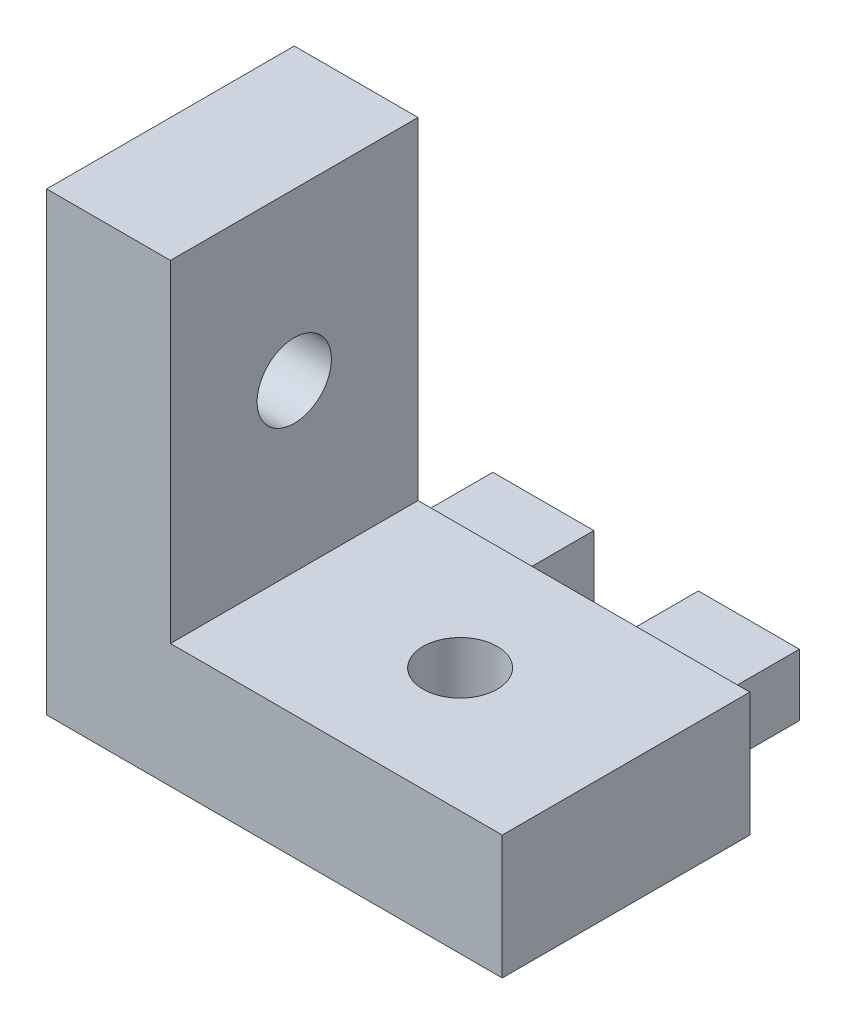
ISO-10303-21;
HEADER;
FILE_DESCRIPTION(('STEP AP214'),'2;1');
FILE_NAME('part.step','',(''),(''),'','','');
FILE_SCHEMA(('AUTOMOTIVE_DESIGN { 1 0 10303 214 1 1 1 1 }'));
ENDSEC;
DATA;
#1=APPLICATION_CONTEXT('core data for automotive mechanical design processes');
#2=APPLICATION_PROTOCOL_DEFINITION('international standard','automotive_design',2000,#1);
#3=PRODUCT_CONTEXT('',#1,'mechanical');
#4=PRODUCT('Part','Part','',(#3));
#5=PRODUCT_RELATED_PRODUCT_CATEGORY('part','',(#4));
#6=PRODUCT_DEFINITION_FORMATION('','',#4);
#7=PRODUCT_DEFINITION_CONTEXT('part definition',#1,'design');
#8=PRODUCT_DEFINITION('design','',#6,#7);
#9=PRODUCT_DEFINITION_SHAPE('','',#8);
#10=(LENGTH_UNIT() NAMED_UNIT(*) SI_UNIT(.MILLI.,.METRE.));
#11=(NAMED_UNIT(*) PLANE_ANGLE_UNIT() SI_UNIT($,.RADIAN.));
#12=(NAMED_UNIT(*) SI_UNIT($,.STERADIAN.) SOLID_ANGLE_UNIT());
#13=UNCERTAINTY_MEASURE_WITH_UNIT(LENGTH_MEASURE(1.E-05),#10,'distance_accuracy_value','');
#14=(GEOMETRIC_REPRESENTATION_CONTEXT(3) GLOBAL_UNCERTAINTY_ASSIGNED_CONTEXT((#13)) GLOBAL_UNIT_ASSIGNED_CONTEXT((#10,
#11,#12)) REPRESENTATION_CONTEXT('',''));
#15=CARTESIAN_POINT('',(0.,0.,0.));
#16=DIRECTION('',(0.,0.,1.));
#17=DIRECTION('',(1.,0.,0.));
#18=AXIS2_PLACEMENT_3D('',#15,#16,#17);
#19=CARTESIAN_POINT('',(0.,0.,0.));
#20=DIRECTION('',(0.,0.,1.));
#21=DIRECTION('',(1.,0.,0.));
#22=AXIS2_PLACEMENT_3D('',#19,#20,#21);
#23=PLANE('',#22);
#24=DIRECTION('',(0.,-1.,0.));
#25=VECTOR('',#24,1.);
#26=CARTESIAN_POINT('',(9.64242424242423,-3.37121212121211,0.));
#27=LINE('',#26,#25);
#28=CARTESIAN_POINT('',(9.64242424242423,-3.37121212121211,0.));
#29=VERTEX_POINT('',#28);
#30=CARTESIAN_POINT('',(9.64242424242423,-5.87121212121211,0.));
#31=VERTEX_POINT('',#30);
#32=EDGE_CURVE('E172',#29,#31,#27,.T.);
#33=ORIENTED_EDGE('',*,*,#32,.F.);
#34=DIRECTION('',(-1.,0.,0.));
#35=VECTOR('',#34,1.);
#36=CARTESIAN_POINT('',(5.56507414431163,-3.37121212121211,0.));
#37=LINE('',#36,#35);
#38=CARTESIAN_POINT('',(5.56507414431163,-3.37121212121211,0.));
#39=VERTEX_POINT('',#38);
#40=EDGE_CURVE('E148',#29,#39,#37,.T.);
#41=ORIENTED_EDGE('',*,*,#40,.T.);
#42=DIRECTION('',(0.,-1.,0.));
#43=VECTOR('',#42,1.);
#44=CARTESIAN_POINT('',(5.56507414431163,-3.37121212121211,0.));
#45=LINE('',#44,#43);
#46=CARTESIAN_POINT('',(5.56507414431163,-5.87121212121211,0.));
#47=VERTEX_POINT('',#46);
#48=EDGE_CURVE('E160',#39,#47,#45,.T.);
#49=ORIENTED_EDGE('',*,*,#48,.T.);
#50=DIRECTION('',(1.,0.,0.));
#51=VECTOR('',#50,1.);
#52=CARTESIAN_POINT('',(-5.75757575757576,-5.87121212121211,0.));
#53=LINE('',#52,#51);
#54=CARTESIAN_POINT('',(1.34242424242423,-5.87121212121211,0.));
#55=VERTEX_POINT('',#54);
#56=EDGE_CURVE('E235',#55,#47,#53,.T.);
#57=ORIENTED_EDGE('',*,*,#56,.F.);
#58=DIRECTION('',(0.,-1.,0.));
#59=VECTOR('',#58,1.);
#60=CARTESIAN_POINT('',(1.34242424242423,-3.37121212121211,0.));
#61=LINE('',#60,#59);
#62=CARTESIAN_POINT('',(1.34242424242423,-3.37121212121211,0.));
#63=VERTEX_POINT('',#62);
#64=EDGE_CURVE('E180',#63,#55,#61,.T.);
#65=ORIENTED_EDGE('',*,*,#64,.F.);
#66=DIRECTION('',(-1.,0.,0.));
#67=VECTOR('',#66,1.);
#68=CARTESIAN_POINT('',(-2.73757575757577,-3.37121212121211,0.));
#69=LINE('',#68,#67);
#70=CARTESIAN_POINT('',(-2.73757575757577,-3.37121212121211,0.));
#71=VERTEX_POINT('',#70);
#72=EDGE_CURVE('E177',#63,#71,#69,.T.);
#73=ORIENTED_EDGE('',*,*,#72,.T.);
#74=DIRECTION('',(0.,-1.,0.));
#75=VECTOR('',#74,1.);
#76=CARTESIAN_POINT('',(-2.73757575757577,-3.37121212121211,0.));
#77=LINE('',#76,#75);
#78=CARTESIAN_POINT('',(-2.73757575757577,-5.87121212121211,0.));
#79=VERTEX_POINT('',#78);
#80=EDGE_CURVE('E182',#71,#79,#77,.T.);
#81=ORIENTED_EDGE('',*,*,#80,.T.);
#82=CARTESIAN_POINT('',(-5.75757575757576,-5.87121212121211,0.));
#83=VERTEX_POINT('',#82);
#84=EDGE_CURVE('E231',#83,#79,#53,.T.);
#85=ORIENTED_EDGE('',*,*,#84,.F.);
#86=DIRECTION('',(0.,-1.,0.));
#87=VECTOR('',#86,1.);
#88=CARTESIAN_POINT('',(-5.75757575757576,12.5287878787879,0.));
#89=LINE('',#88,#87);
#90=CARTESIAN_POINT('',(-5.75757575757576,12.5287878787879,0.));
#91=VERTEX_POINT('',#90);
#92=EDGE_CURVE('E212',#91,#83,#89,.T.);
#93=ORIENTED_EDGE('',*,*,#92,.F.);
#94=DIRECTION('',(-1.,0.,0.));
#95=VECTOR('',#94,1.);
#96=CARTESIAN_POINT('',(-0.757575757575761,12.5287878787879,0.));
#97=LINE('',#96,#95);
#98=CARTESIAN_POINT('',(-0.757575757575761,12.5287878787879,0.));
#99=VERTEX_POINT('',#98);
#100=EDGE_CURVE('E217',#99,#91,#97,.T.);
#101=ORIENTED_EDGE('',*,*,#100,.F.);
#102=DIRECTION('',(0.,1.,0.));
#103=VECTOR('',#102,1.);
#104=CARTESIAN_POINT('',(-0.757575757575761,-0.871212121212111,0.));
#105=LINE('',#104,#103);
#106=CARTESIAN_POINT('',(-0.757575757575761,-0.871212121212111,0.));
#107=VERTEX_POINT('',#106);
#108=EDGE_CURVE('E239',#107,#99,#105,.T.);
#109=ORIENTED_EDGE('',*,*,#108,.F.);
#110=DIRECTION('',(-1.,0.,0.));
#111=VECTOR('',#110,1.);
#112=CARTESIAN_POINT('',(12.6424242424242,-0.871212121212109,0.));
#113=LINE('',#112,#111);
#114=CARTESIAN_POINT('',(12.6424242424242,-0.871212121212109,0.));
#115=VERTEX_POINT('',#114);
#116=EDGE_CURVE('E237',#115,#107,#113,.T.);
#117=ORIENTED_EDGE('',*,*,#116,.F.);
#118=DIRECTION('',(0.,1.,0.));
#119=VECTOR('',#118,1.);
#120=CARTESIAN_POINT('',(12.6424242424242,-5.87121212121211,0.));
#121=LINE('',#120,#119);
#122=CARTESIAN_POINT('',(12.6424242424242,-5.87121212121211,0.));
#123=VERTEX_POINT('',#122);
#124=EDGE_CURVE('E234',#123,#115,#121,.T.);
#125=ORIENTED_EDGE('',*,*,#124,.F.);
#126=EDGE_CURVE('E230',#31,#123,#53,.T.);
#127=ORIENTED_EDGE('',*,*,#126,.F.);
#128=EDGE_LOOP('',(#33,#41,#49,#57,#65,#73,#81,#85,#93,#101,#109,#117,#125,#127));
#129=FACE_BOUND('',#128,.T.);
#130=ADVANCED_FACE('F39',(#129),#23,.F.);
#131=CARTESIAN_POINT('',(-5.75757575757576,12.5287878787879,10.));
#132=DIRECTION('',(1.,0.,0.));
#133=DIRECTION('',(0.,1.,0.));
#134=AXIS2_PLACEMENT_3D('',#131,#132,#133);
#135=PLANE('',#134);
#136=CARTESIAN_POINT('',(-5.75757575757576,5.82878787878789,5.));
#137=DIRECTION('',(1.,0.,0.));
#138=DIRECTION('',(0.,1.,0.));
#139=AXIS2_PLACEMENT_3D('',#136,#137,#138);
#140=CIRCLE('',#139,1.5);
#141=CARTESIAN_POINT('',(-5.75757575757576,7.32878787878789,5.));
#142=VERTEX_POINT('',#141);
#143=EDGE_CURVE('E203',#142,#142,#140,.F.);
#144=ORIENTED_EDGE('',*,*,#143,.F.);
#145=EDGE_LOOP('',(#144));
#146=FACE_BOUND('',#145,.T.);
#147=ORIENTED_EDGE('',*,*,#92,.T.);
#148=DIRECTION('',(0.,0.,-1.));
#149=VECTOR('',#148,1.);
#150=CARTESIAN_POINT('',(-5.75757575757576,-5.87121212121211,10.));
#151=LINE('',#150,#149);
#152=CARTESIAN_POINT('',(-5.75757575757576,-5.87121212121211,10.));
#153=VERTEX_POINT('',#152);
#154=EDGE_CURVE('E11',#153,#83,#151,.T.);
#155=ORIENTED_EDGE('',*,*,#154,.F.);
#156=DIRECTION('',(0.,-1.,0.));
#157=VECTOR('',#156,1.);
#158=CARTESIAN_POINT('',(-5.75757575757576,12.5287878787879,10.));
#159=LINE('',#158,#157);
#160=CARTESIAN_POINT('',(-5.75757575757576,12.5287878787879,10.));
#161=VERTEX_POINT('',#160);
#162=EDGE_CURVE('E213',#161,#153,#159,.T.);
#163=ORIENTED_EDGE('',*,*,#162,.F.);
#164=DIRECTION('',(0.,0.,-1.));
#165=VECTOR('',#164,1.);
#166=CARTESIAN_POINT('',(-5.75757575757576,12.5287878787879,10.));
#167=LINE('',#166,#165);
#168=EDGE_CURVE('E227',#161,#91,#167,.T.);
#169=ORIENTED_EDGE('',*,*,#168,.T.);
#170=EDGE_LOOP('',(#147,#155,#163,#169));
#171=FACE_BOUND('',#170,.T.);
#172=ADVANCED_FACE('F41',(#146,#171),#135,.F.);
#173=CARTESIAN_POINT('',(-5.75757575757576,-5.87121212121211,10.));
#174=DIRECTION('',(0.,1.,0.));
#175=DIRECTION('',(-1.,0.,0.));
#176=AXIS2_PLACEMENT_3D('',#173,#174,#175);
#177=PLANE('',#176);
#178=CARTESIAN_POINT('',(5.94242424242424,-5.87121212121211,5.));
#179=DIRECTION('',(0.,1.,0.));
#180=DIRECTION('',(-1.,0.,0.));
#181=AXIS2_PLACEMENT_3D('',#178,#179,#180);
#182=CIRCLE('',#181,1.5);
#183=CARTESIAN_POINT('',(4.44242424242424,-5.87121212121211,5.));
#184=VERTEX_POINT('',#183);
#185=EDGE_CURVE('E209',#184,#184,#182,.F.);
#186=ORIENTED_EDGE('',*,*,#185,.F.);
#187=EDGE_LOOP('',(#186));
#188=FACE_BOUND('',#187,.T.);
#189=ORIENTED_EDGE('',*,*,#84,.T.);
#190=DIRECTION('',(0.,0.,-1.));
#191=VECTOR('',#190,1.);
#192=CARTESIAN_POINT('',(-2.73757575757577,-5.87121212121211,-5.));
#193=LINE('',#192,#191);
#194=CARTESIAN_POINT('',(-2.73757575757577,-5.87121212121211,-5.));
#195=VERTEX_POINT('',#194);
#196=EDGE_CURVE('E62',#79,#195,#193,.T.);
#197=ORIENTED_EDGE('',*,*,#196,.T.);
#198=DIRECTION('',(1.,0.,0.));
#199=VECTOR('',#198,1.);
#200=CARTESIAN_POINT('',(-2.73757575757577,-5.87121212121211,-5.));
#201=LINE('',#200,#199);
#202=CARTESIAN_POINT('',(1.34242424242423,-5.87121212121211,-5.));
#203=VERTEX_POINT('',#202);
#204=EDGE_CURVE('E187',#195,#203,#201,.T.);
#205=ORIENTED_EDGE('',*,*,#204,.T.);
#206=DIRECTION('',(0.,0.,1.));
#207=VECTOR('',#206,1.);
#208=CARTESIAN_POINT('',(1.34242424242423,-5.87121212121211,-5.));
#209=LINE('',#208,#207);
#210=EDGE_CURVE('E184',#203,#55,#209,.T.);
#211=ORIENTED_EDGE('',*,*,#210,.T.);
#212=ORIENTED_EDGE('',*,*,#56,.T.);
#213=DIRECTION('',(0.,0.,-1.));
#214=VECTOR('',#213,1.);
#215=CARTESIAN_POINT('',(5.56507414431163,-5.87121212121211,-5.));
#216=LINE('',#215,#214);
#217=CARTESIAN_POINT('',(5.56507414431163,-5.87121212121211,-5.));
#218=VERTEX_POINT('',#217);
#219=EDGE_CURVE('E54',#47,#218,#216,.T.);
#220=ORIENTED_EDGE('',*,*,#219,.T.);
#221=DIRECTION('',(1.,0.,0.));
#222=VECTOR('',#221,1.);
#223=CARTESIAN_POINT('',(5.56507414431163,-5.87121212121211,-5.));
#224=LINE('',#223,#222);
#225=CARTESIAN_POINT('',(9.64242424242423,-5.87121212121211,-5.));
#226=VERTEX_POINT('',#225);
#227=EDGE_CURVE('E145',#218,#226,#224,.T.);
#228=ORIENTED_EDGE('',*,*,#227,.T.);
#229=DIRECTION('',(0.,0.,1.));
#230=VECTOR('',#229,1.);
#231=CARTESIAN_POINT('',(9.64242424242423,-5.87121212121211,-5.));
#232=LINE('',#231,#230);
#233=EDGE_CURVE('E161',#226,#31,#232,.T.);
#234=ORIENTED_EDGE('',*,*,#233,.T.);
#235=ORIENTED_EDGE('',*,*,#126,.T.);
#236=DIRECTION('',(0.,0.,-1.));
#237=VECTOR('',#236,1.);
#238=CARTESIAN_POINT('',(12.6424242424242,-5.87121212121211,10.));
#239=LINE('',#238,#237);
#240=CARTESIAN_POINT('',(12.6424242424242,-5.87121212121211,10.));
#241=VERTEX_POINT('',#240);
#242=EDGE_CURVE('E47',#241,#123,#239,.T.);
#243=ORIENTED_EDGE('',*,*,#242,.F.);
#244=DIRECTION('',(1.,0.,0.));
#245=VECTOR('',#244,1.);
#246=CARTESIAN_POINT('',(-5.75757575757576,-5.87121212121211,10.));
#247=LINE('',#246,#245);
#248=EDGE_CURVE('E216',#153,#241,#247,.T.);
#249=ORIENTED_EDGE('',*,*,#248,.F.);
#250=ORIENTED_EDGE('',*,*,#154,.T.);
#251=EDGE_LOOP('',(#189,#197,#205,#211,#212,#220,#228,#234,#235,#243,#249,#250));
#252=FACE_BOUND('',#251,.T.);
#253=ADVANCED_FACE('F280',(#188,#252),#177,.F.);
#254=CARTESIAN_POINT('',(12.6424242424242,-5.87121212121211,10.));
#255=DIRECTION('',(-1.,0.,0.));
#256=DIRECTION('',(0.,0.,1.));
#257=AXIS2_PLACEMENT_3D('',#254,#255,#256);
#258=PLANE('',#257);
#259=ORIENTED_EDGE('',*,*,#124,.T.);
#260=DIRECTION('',(0.,0.,-1.));
#261=VECTOR('',#260,1.);
#262=CARTESIAN_POINT('',(12.6424242424242,-0.871212121212109,10.));
#263=LINE('',#262,#261);
#264=CARTESIAN_POINT('',(12.6424242424242,-0.871212121212109,10.));
#265=VERTEX_POINT('',#264);
#266=EDGE_CURVE('E250',#265,#115,#263,.T.);
#267=ORIENTED_EDGE('',*,*,#266,.F.);
#268=DIRECTION('',(0.,1.,0.));
#269=VECTOR('',#268,1.);
#270=CARTESIAN_POINT('',(12.6424242424242,-5.87121212121211,10.));
#271=LINE('',#270,#269);
#272=EDGE_CURVE('E219',#241,#265,#271,.T.);
#273=ORIENTED_EDGE('',*,*,#272,.F.);
#274=ORIENTED_EDGE('',*,*,#242,.T.);
#275=EDGE_LOOP('',(#259,#267,#273,#274));
#276=FACE_BOUND('',#275,.T.);
#277=ADVANCED_FACE('F257',(#276),#258,.F.);
#278=CARTESIAN_POINT('',(12.6424242424242,-0.871212121212109,10.));
#279=DIRECTION('',(0.,-1.,0.));
#280=DIRECTION('',(1.,0.,0.));
#281=AXIS2_PLACEMENT_3D('',#278,#279,#280);
#282=PLANE('',#281);
#283=CARTESIAN_POINT('',(5.94242424242424,-0.87121212121211,5.));
#284=DIRECTION('',(0.,1.,0.));
#285=DIRECTION('',(-1.,0.,0.));
#286=AXIS2_PLACEMENT_3D('',#283,#284,#285);
#287=CIRCLE('',#286,1.5);
#288=CARTESIAN_POINT('',(4.44242424242424,-0.87121212121211,5.));
#289=VERTEX_POINT('',#288);
#290=EDGE_CURVE('E206',#289,#289,#287,.T.);
#291=ORIENTED_EDGE('',*,*,#290,.F.);
#292=EDGE_LOOP('',(#291));
#293=FACE_BOUND('',#292,.T.);
#294=ORIENTED_EDGE('',*,*,#116,.T.);
#295=DIRECTION('',(0.,0.,-1.));
#296=VECTOR('',#295,1.);
#297=CARTESIAN_POINT('',(-0.757575757575761,-0.871212121212111,10.));
#298=LINE('',#297,#296);
#299=CARTESIAN_POINT('',(-0.757575757575761,-0.871212121212111,10.));
#300=VERTEX_POINT('',#299);
#301=EDGE_CURVE('E247',#300,#107,#298,.T.);
#302=ORIENTED_EDGE('',*,*,#301,.F.);
#303=DIRECTION('',(-1.,0.,0.));
#304=VECTOR('',#303,1.);
#305=CARTESIAN_POINT('',(12.6424242424242,-0.871212121212109,10.));
#306=LINE('',#305,#304);
#307=EDGE_CURVE('E221',#265,#300,#306,.T.);
#308=ORIENTED_EDGE('',*,*,#307,.F.);
#309=ORIENTED_EDGE('',*,*,#266,.T.);
#310=EDGE_LOOP('',(#294,#302,#308,#309));
#311=FACE_BOUND('',#310,.T.);
#312=ADVANCED_FACE('F268',(#293,#311),#282,.F.);
#313=CARTESIAN_POINT('',(-0.757575757575761,-0.871212121212111,10.));
#314=DIRECTION('',(-1.,0.,0.));
#315=DIRECTION('',(0.,0.,1.));
#316=AXIS2_PLACEMENT_3D('',#313,#314,#315);
#317=PLANE('',#316);
#318=CARTESIAN_POINT('',(-0.757575757575761,5.82878787878789,5.));
#319=DIRECTION('',(1.,0.,0.));
#320=DIRECTION('',(0.,0.,-1.));
#321=AXIS2_PLACEMENT_3D('',#318,#319,#320);
#322=CIRCLE('',#321,1.5);
#323=CARTESIAN_POINT('',(-0.757575757575761,5.82878787878789,3.5));
#324=VERTEX_POINT('',#323);
#325=EDGE_CURVE('E171',#324,#324,#322,.T.);
#326=ORIENTED_EDGE('',*,*,#325,.F.);
#327=EDGE_LOOP('',(#326));
#328=FACE_BOUND('',#327,.T.);
#329=ORIENTED_EDGE('',*,*,#108,.T.);
#330=DIRECTION('',(0.,0.,-1.));
#331=VECTOR('',#330,1.);
#332=CARTESIAN_POINT('',(-0.757575757575761,12.5287878787879,10.));
#333=LINE('',#332,#331);
#334=CARTESIAN_POINT('',(-0.757575757575761,12.5287878787879,10.));
#335=VERTEX_POINT('',#334);
#336=EDGE_CURVE('E244',#335,#99,#333,.T.);
#337=ORIENTED_EDGE('',*,*,#336,.F.);
#338=DIRECTION('',(0.,1.,0.));
#339=VECTOR('',#338,1.);
#340=CARTESIAN_POINT('',(-0.757575757575761,-0.871212121212111,10.));
#341=LINE('',#340,#339);
#342=EDGE_CURVE('E223',#300,#335,#341,.T.);
#343=ORIENTED_EDGE('',*,*,#342,.F.);
#344=ORIENTED_EDGE('',*,*,#301,.T.);
#345=EDGE_LOOP('',(#329,#337,#343,#344));
#346=FACE_BOUND('',#345,.T.);
#347=ADVANCED_FACE('F272',(#328,#346),#317,.F.);
#348=CARTESIAN_POINT('',(-0.757575757575761,12.5287878787879,10.));
#349=DIRECTION('',(0.,-1.,0.));
#350=DIRECTION('',(0.,0.,-1.));
#351=AXIS2_PLACEMENT_3D('',#348,#349,#350);
#352=PLANE('',#351);
#353=ORIENTED_EDGE('',*,*,#100,.T.);
#354=ORIENTED_EDGE('',*,*,#168,.F.);
#355=DIRECTION('',(-1.,0.,0.));
#356=VECTOR('',#355,1.);
#357=CARTESIAN_POINT('',(-0.757575757575761,12.5287878787879,10.));
#358=LINE('',#357,#356);
#359=EDGE_CURVE('E225',#335,#161,#358,.T.);
#360=ORIENTED_EDGE('',*,*,#359,.F.);
#361=ORIENTED_EDGE('',*,*,#336,.T.);
#362=EDGE_LOOP('',(#353,#354,#360,#361));
#363=FACE_BOUND('',#362,.T.);
#364=ADVANCED_FACE('F321',(#363),#352,.F.);
#365=CARTESIAN_POINT('',(0.,0.,10.));
#366=DIRECTION('',(0.,0.,1.));
#367=DIRECTION('',(1.,0.,0.));
#368=AXIS2_PLACEMENT_3D('',#365,#366,#367);
#369=PLANE('',#368);
#370=ORIENTED_EDGE('',*,*,#162,.T.);
#371=ORIENTED_EDGE('',*,*,#248,.T.);
#372=ORIENTED_EDGE('',*,*,#272,.T.);
#373=ORIENTED_EDGE('',*,*,#307,.T.);
#374=ORIENTED_EDGE('',*,*,#342,.T.);
#375=ORIENTED_EDGE('',*,*,#359,.T.);
#376=EDGE_LOOP('',(#370,#371,#372,#373,#374,#375));
#377=FACE_BOUND('',#376,.T.);
#378=ADVANCED_FACE('F276',(#377),#369,.T.);
#379=CARTESIAN_POINT('',(5.94242424242424,-5.87221212121211,5.));
#380=DIRECTION('',(0.,1.,0.));
#381=DIRECTION('',(-1.,0.,0.));
#382=AXIS2_PLACEMENT_3D('',#379,#380,#381);
#383=CYLINDRICAL_SURFACE('',#382,1.5);
#384=ORIENTED_EDGE('',*,*,#290,.T.);
#385=EDGE_LOOP('',(#384));
#386=FACE_BOUND('',#385,.T.);
#387=ORIENTED_EDGE('',*,*,#185,.T.);
#388=EDGE_LOOP('',(#387));
#389=FACE_BOUND('',#388,.T.);
#390=ADVANCED_FACE('F338',(#386,#389),#383,.F.);
#391=CARTESIAN_POINT('',(-5.75857575757576,5.82878787878789,5.));
#392=DIRECTION('',(1.,0.,0.));
#393=DIRECTION('',(0.,0.,-1.));
#394=AXIS2_PLACEMENT_3D('',#391,#392,#393);
#395=CYLINDRICAL_SURFACE('',#394,1.5);
#396=ORIENTED_EDGE('',*,*,#325,.T.);
#397=EDGE_LOOP('',(#396));
#398=FACE_BOUND('',#397,.T.);
#399=ORIENTED_EDGE('',*,*,#143,.T.);
#400=EDGE_LOOP('',(#399));
#401=FACE_BOUND('',#400,.T.);
#402=ADVANCED_FACE('F340',(#398,#401),#395,.F.);
#403=CARTESIAN_POINT('',(-2.73757575757577,-3.37121212121211,-5.));
#404=DIRECTION('',(-1.,0.,0.));
#405=DIRECTION('',(0.,-1.,0.));
#406=AXIS2_PLACEMENT_3D('',#403,#404,#405);
#407=PLANE('',#406);
#408=ORIENTED_EDGE('',*,*,#196,.F.);
#409=ORIENTED_EDGE('',*,*,#80,.F.);
#410=DIRECTION('',(0.,0.,-1.));
#411=VECTOR('',#410,1.);
#412=CARTESIAN_POINT('',(-2.73757575757577,-3.37121212121211,-5.));
#413=LINE('',#412,#411);
#414=CARTESIAN_POINT('',(-2.73757575757577,-3.37121212121211,-5.));
#415=VERTEX_POINT('',#414);
#416=EDGE_CURVE('E188',#71,#415,#413,.T.);
#417=ORIENTED_EDGE('',*,*,#416,.T.);
#418=DIRECTION('',(0.,-1.,0.));
#419=VECTOR('',#418,1.);
#420=CARTESIAN_POINT('',(-2.73757575757577,-3.37121212121211,-5.));
#421=LINE('',#420,#419);
#422=EDGE_CURVE('E175',#415,#195,#421,.T.);
#423=ORIENTED_EDGE('',*,*,#422,.T.);
#424=EDGE_LOOP('',(#408,#409,#417,#423));
#425=FACE_BOUND('',#424,.T.);
#426=ADVANCED_FACE('F286',(#425),#407,.T.);
#427=CARTESIAN_POINT('',(1.34242424242423,-3.37121212121211,-5.));
#428=DIRECTION('',(1.,0.,0.));
#429=DIRECTION('',(0.,1.,0.));
#430=AXIS2_PLACEMENT_3D('',#427,#428,#429);
#431=PLANE('',#430);
#432=ORIENTED_EDGE('',*,*,#210,.F.);
#433=DIRECTION('',(0.,-1.,0.));
#434=VECTOR('',#433,1.);
#435=CARTESIAN_POINT('',(1.34242424242423,-3.37121212121211,-5.));
#436=LINE('',#435,#434);
#437=CARTESIAN_POINT('',(1.34242424242423,-3.37121212121211,-5.));
#438=VERTEX_POINT('',#437);
#439=EDGE_CURVE('E178',#438,#203,#436,.T.);
#440=ORIENTED_EDGE('',*,*,#439,.F.);
#441=DIRECTION('',(0.,0.,1.));
#442=VECTOR('',#441,1.);
#443=CARTESIAN_POINT('',(1.34242424242423,-3.37121212121211,-5.));
#444=LINE('',#443,#442);
#445=EDGE_CURVE('E194',#438,#63,#444,.T.);
#446=ORIENTED_EDGE('',*,*,#445,.T.);
#447=ORIENTED_EDGE('',*,*,#64,.T.);
#448=EDGE_LOOP('',(#432,#440,#446,#447));
#449=FACE_BOUND('',#448,.T.);
#450=ADVANCED_FACE('F350',(#449),#431,.T.);
#451=CARTESIAN_POINT('',(-2.73757575757577,-3.37121212121211,-5.));
#452=DIRECTION('',(0.,0.,-1.));
#453=DIRECTION('',(-1.,0.,0.));
#454=AXIS2_PLACEMENT_3D('',#451,#452,#453);
#455=PLANE('',#454);
#456=ORIENTED_EDGE('',*,*,#204,.F.);
#457=ORIENTED_EDGE('',*,*,#422,.F.);
#458=DIRECTION('',(1.,0.,0.));
#459=VECTOR('',#458,1.);
#460=CARTESIAN_POINT('',(-2.73757575757577,-3.37121212121211,-5.));
#461=LINE('',#460,#459);
#462=EDGE_CURVE('E196',#415,#438,#461,.T.);
#463=ORIENTED_EDGE('',*,*,#462,.T.);
#464=ORIENTED_EDGE('',*,*,#439,.T.);
#465=EDGE_LOOP('',(#456,#457,#463,#464));
#466=FACE_BOUND('',#465,.T.);
#467=ADVANCED_FACE('F293',(#466),#455,.T.);
#468=CARTESIAN_POINT('',(0.,-3.37121212121211,0.));
#469=DIRECTION('',(0.,1.,0.));
#470=DIRECTION('',(0.,0.,1.));
#471=AXIS2_PLACEMENT_3D('',#468,#469,#470);
#472=PLANE('',#471);
#473=ORIENTED_EDGE('',*,*,#416,.F.);
#474=ORIENTED_EDGE('',*,*,#72,.F.);
#475=ORIENTED_EDGE('',*,*,#445,.F.);
#476=ORIENTED_EDGE('',*,*,#462,.F.);
#477=EDGE_LOOP('',(#473,#474,#475,#476));
#478=FACE_BOUND('',#477,.T.);
#479=ADVANCED_FACE('F289',(#478),#472,.T.);
#480=CARTESIAN_POINT('',(5.56507414431163,-3.37121212121211,-5.));
#481=DIRECTION('',(-1.,0.,0.));
#482=DIRECTION('',(0.,-1.,0.));
#483=AXIS2_PLACEMENT_3D('',#480,#481,#482);
#484=PLANE('',#483);
#485=ORIENTED_EDGE('',*,*,#219,.F.);
#486=ORIENTED_EDGE('',*,*,#48,.F.);
#487=DIRECTION('',(0.,0.,-1.));
#488=VECTOR('',#487,1.);
#489=CARTESIAN_POINT('',(5.56507414431163,-3.37121212121211,-5.));
#490=LINE('',#489,#488);
#491=CARTESIAN_POINT('',(5.56507414431163,-3.37121212121211,-5.));
#492=VERTEX_POINT('',#491);
#493=EDGE_CURVE('E155',#39,#492,#490,.T.);
#494=ORIENTED_EDGE('',*,*,#493,.T.);
#495=DIRECTION('',(0.,-1.,0.));
#496=VECTOR('',#495,1.);
#497=CARTESIAN_POINT('',(5.56507414431163,-3.37121212121211,-5.));
#498=LINE('',#497,#496);
#499=EDGE_CURVE('E140',#492,#218,#498,.T.);
#500=ORIENTED_EDGE('',*,*,#499,.T.);
#501=EDGE_LOOP('',(#485,#486,#494,#500));
#502=FACE_BOUND('',#501,.T.);
#503=ADVANCED_FACE('F159',(#502),#484,.T.);
#504=CARTESIAN_POINT('',(9.64242424242423,-3.37121212121211,-5.));
#505=DIRECTION('',(1.,0.,0.));
#506=DIRECTION('',(0.,1.,0.));
#507=AXIS2_PLACEMENT_3D('',#504,#505,#506);
#508=PLANE('',#507);
#509=ORIENTED_EDGE('',*,*,#233,.F.);
#510=DIRECTION('',(0.,-1.,0.));
#511=VECTOR('',#510,1.);
#512=CARTESIAN_POINT('',(9.64242424242423,-3.37121212121211,-5.));
#513=LINE('',#512,#511);
#514=CARTESIAN_POINT('',(9.64242424242423,-3.37121212121211,-5.));
#515=VERTEX_POINT('',#514);
#516=EDGE_CURVE('E147',#515,#226,#513,.T.);
#517=ORIENTED_EDGE('',*,*,#516,.F.);
#518=DIRECTION('',(0.,0.,1.));
#519=VECTOR('',#518,1.);
#520=CARTESIAN_POINT('',(9.64242424242423,-3.37121212121211,-5.));
#521=LINE('',#520,#519);
#522=EDGE_CURVE('E157',#515,#29,#521,.T.);
#523=ORIENTED_EDGE('',*,*,#522,.T.);
#524=ORIENTED_EDGE('',*,*,#32,.T.);
#525=EDGE_LOOP('',(#509,#517,#523,#524));
#526=FACE_BOUND('',#525,.T.);
#527=ADVANCED_FACE('F300',(#526),#508,.T.);
#528=CARTESIAN_POINT('',(5.56507414431163,-3.37121212121211,-5.));
#529=DIRECTION('',(0.,0.,-1.));
#530=DIRECTION('',(-1.,0.,0.));
#531=AXIS2_PLACEMENT_3D('',#528,#529,#530);
#532=PLANE('',#531);
#533=ORIENTED_EDGE('',*,*,#227,.F.);
#534=ORIENTED_EDGE('',*,*,#499,.F.);
#535=DIRECTION('',(1.,0.,0.));
#536=VECTOR('',#535,1.);
#537=CARTESIAN_POINT('',(5.56507414431163,-3.37121212121211,-5.));
#538=LINE('',#537,#536);
#539=EDGE_CURVE('E143',#492,#515,#538,.T.);
#540=ORIENTED_EDGE('',*,*,#539,.T.);
#541=ORIENTED_EDGE('',*,*,#516,.T.);
#542=EDGE_LOOP('',(#533,#534,#540,#541));
#543=FACE_BOUND('',#542,.T.);
#544=ADVANCED_FACE('F142',(#543),#532,.T.);
#545=CARTESIAN_POINT('',(0.,-3.37121212121211,0.));
#546=DIRECTION('',(0.,1.,0.));
#547=DIRECTION('',(-1.,0.,0.));
#548=AXIS2_PLACEMENT_3D('',#545,#546,#547);
#549=PLANE('',#548);
#550=ORIENTED_EDGE('',*,*,#493,.F.);
#551=ORIENTED_EDGE('',*,*,#40,.F.);
#552=ORIENTED_EDGE('',*,*,#522,.F.);
#553=ORIENTED_EDGE('',*,*,#539,.F.);
#554=EDGE_LOOP('',(#550,#551,#552,#553));
#555=FACE_BOUND('',#554,.T.);
#556=ADVANCED_FACE('F153',(#555),#549,.T.);
#557=CLOSED_SHELL('',(#130,#172,#253,#277,#312,#347,#364,#378,#390,#402,#426,#450,#467,#479,
#503,#527,#544,#556));
#558=MANIFOLD_SOLID_BREP('B2',#557);
#559=ADVANCED_BREP_SHAPE_REPRESENTATION('',(#18,#558),#14);
#560=SHAPE_DEFINITION_REPRESENTATION(#9,#559);
ENDSEC;
END-ISO-10303-21;
